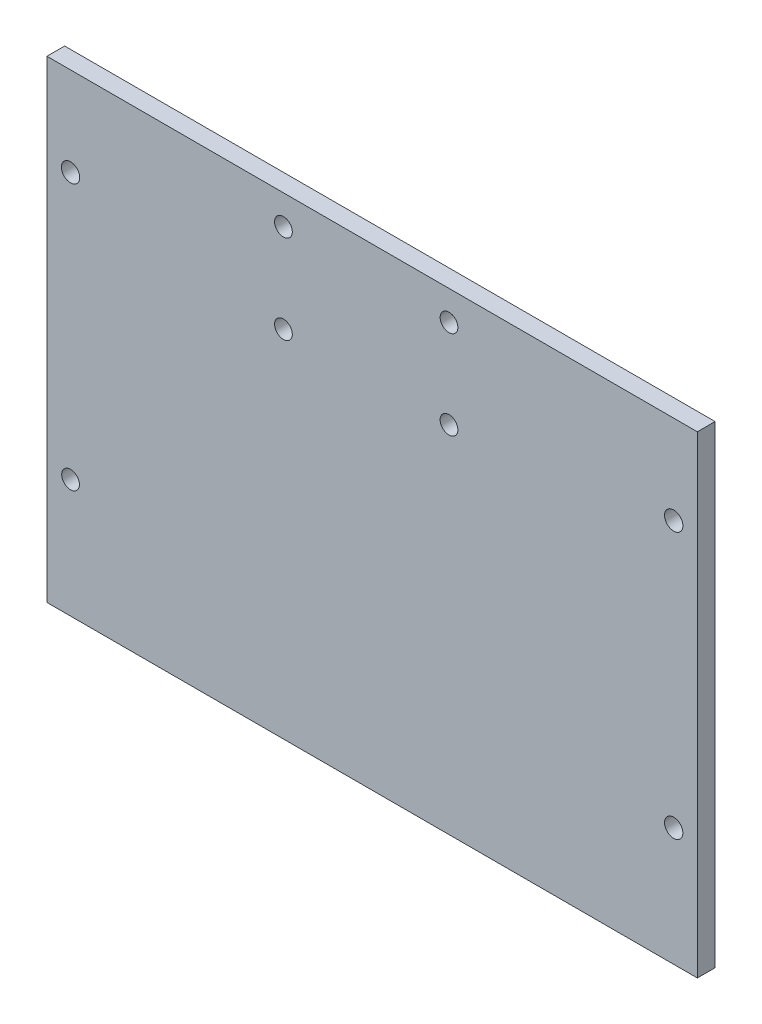
ISO-10303-21;
HEADER;
FILE_DESCRIPTION(('STEP AP214'),'2;1');
FILE_NAME('part.step','',(''),(''),'','','');
FILE_SCHEMA(('AUTOMOTIVE_DESIGN { 1 0 10303 214 1 1 1 1 }'));
ENDSEC;
DATA;
#1=APPLICATION_CONTEXT('core data for automotive mechanical design processes');
#2=APPLICATION_PROTOCOL_DEFINITION('international standard','automotive_design',2000,#1);
#3=PRODUCT_CONTEXT('',#1,'mechanical');
#4=PRODUCT('Part','Part','',(#3));
#5=PRODUCT_RELATED_PRODUCT_CATEGORY('part','',(#4));
#6=PRODUCT_DEFINITION_FORMATION('','',#4);
#7=PRODUCT_DEFINITION_CONTEXT('part definition',#1,'design');
#8=PRODUCT_DEFINITION('design','',#6,#7);
#9=PRODUCT_DEFINITION_SHAPE('','',#8);
#10=(LENGTH_UNIT() NAMED_UNIT(*) SI_UNIT(.MILLI.,.METRE.));
#11=(NAMED_UNIT(*) PLANE_ANGLE_UNIT() SI_UNIT($,.RADIAN.));
#12=(NAMED_UNIT(*) SI_UNIT($,.STERADIAN.) SOLID_ANGLE_UNIT());
#13=UNCERTAINTY_MEASURE_WITH_UNIT(LENGTH_MEASURE(1.E-05),#10,'distance_accuracy_value','');
#14=(GEOMETRIC_REPRESENTATION_CONTEXT(3) GLOBAL_UNCERTAINTY_ASSIGNED_CONTEXT((#13)) GLOBAL_UNIT_ASSIGNED_CONTEXT((#10,
#11,#12)) REPRESENTATION_CONTEXT('',''));
#15=CARTESIAN_POINT('',(0.,0.,0.));
#16=DIRECTION('',(0.,0.,1.));
#17=DIRECTION('',(1.,0.,0.));
#18=AXIS2_PLACEMENT_3D('',#15,#16,#17);
#19=CARTESIAN_POINT('',(-55.,-40.,3.));
#20=DIRECTION('',(1.,0.,0.));
#21=DIRECTION('',(0.,0.,-1.));
#22=AXIS2_PLACEMENT_3D('',#19,#20,#21);
#23=PLANE('',#22);
#24=DIRECTION('',(0.,-1.,0.));
#25=VECTOR('',#24,1.);
#26=CARTESIAN_POINT('',(-55.,-40.,0.));
#27=LINE('',#26,#25);
#28=CARTESIAN_POINT('',(-55.,40.,0.));
#29=VERTEX_POINT('',#28);
#30=CARTESIAN_POINT('',(-55.,-40.,0.));
#31=VERTEX_POINT('',#30);
#32=EDGE_CURVE('E111',#29,#31,#27,.T.);
#33=ORIENTED_EDGE('',*,*,#32,.T.);
#34=DIRECTION('',(0.,0.,-1.));
#35=VECTOR('',#34,1.);
#36=CARTESIAN_POINT('',(-55.,-40.,3.));
#37=LINE('',#36,#35);
#38=CARTESIAN_POINT('',(-55.,-40.,3.));
#39=VERTEX_POINT('',#38);
#40=EDGE_CURVE('E11',#39,#31,#37,.T.);
#41=ORIENTED_EDGE('',*,*,#40,.F.);
#42=DIRECTION('',(0.,-1.,0.));
#43=VECTOR('',#42,1.);
#44=CARTESIAN_POINT('',(-55.,-40.,3.));
#45=LINE('',#44,#43);
#46=CARTESIAN_POINT('',(-55.,40.,3.));
#47=VERTEX_POINT('',#46);
#48=EDGE_CURVE('E95',#47,#39,#45,.T.);
#49=ORIENTED_EDGE('',*,*,#48,.F.);
#50=DIRECTION('',(0.,0.,-1.));
#51=VECTOR('',#50,1.);
#52=CARTESIAN_POINT('',(-55.,40.,3.));
#53=LINE('',#52,#51);
#54=EDGE_CURVE('E107',#47,#29,#53,.T.);
#55=ORIENTED_EDGE('',*,*,#54,.T.);
#56=EDGE_LOOP('',(#33,#41,#49,#55));
#57=FACE_BOUND('',#56,.T.);
#58=ADVANCED_FACE('F43',(#57),#23,.F.);
#59=CARTESIAN_POINT('',(55.,-40.,3.));
#60=DIRECTION('',(0.,1.,0.));
#61=DIRECTION('',(-1.,0.,0.));
#62=AXIS2_PLACEMENT_3D('',#59,#60,#61);
#63=PLANE('',#62);
#64=DIRECTION('',(1.,0.,0.));
#65=VECTOR('',#64,1.);
#66=CARTESIAN_POINT('',(55.,-40.,0.));
#67=LINE('',#66,#65);
#68=CARTESIAN_POINT('',(55.,-40.,0.));
#69=VERTEX_POINT('',#68);
#70=EDGE_CURVE('E100',#31,#69,#67,.T.);
#71=ORIENTED_EDGE('',*,*,#70,.T.);
#72=DIRECTION('',(0.,0.,-1.));
#73=VECTOR('',#72,1.);
#74=CARTESIAN_POINT('',(55.,-40.,3.));
#75=LINE('',#74,#73);
#76=CARTESIAN_POINT('',(55.,-40.,3.));
#77=VERTEX_POINT('',#76);
#78=EDGE_CURVE('E52',#77,#69,#75,.T.);
#79=ORIENTED_EDGE('',*,*,#78,.F.);
#80=DIRECTION('',(1.,0.,0.));
#81=VECTOR('',#80,1.);
#82=CARTESIAN_POINT('',(55.,-40.,3.));
#83=LINE('',#82,#81);
#84=EDGE_CURVE('E90',#39,#77,#83,.T.);
#85=ORIENTED_EDGE('',*,*,#84,.F.);
#86=ORIENTED_EDGE('',*,*,#40,.T.);
#87=EDGE_LOOP('',(#71,#79,#85,#86));
#88=FACE_BOUND('',#87,.T.);
#89=ADVANCED_FACE('F99',(#88),#63,.F.);
#90=CARTESIAN_POINT('',(55.,-40.,3.));
#91=DIRECTION('',(-1.,0.,0.));
#92=DIRECTION('',(0.,0.,1.));
#93=AXIS2_PLACEMENT_3D('',#90,#91,#92);
#94=PLANE('',#93);
#95=DIRECTION('',(0.,1.,0.));
#96=VECTOR('',#95,1.);
#97=CARTESIAN_POINT('',(55.,-40.,0.));
#98=LINE('',#97,#96);
#99=CARTESIAN_POINT('',(55.,40.,0.));
#100=VERTEX_POINT('',#99);
#101=EDGE_CURVE('E77',#69,#100,#98,.T.);
#102=ORIENTED_EDGE('',*,*,#101,.T.);
#103=DIRECTION('',(0.,0.,-1.));
#104=VECTOR('',#103,1.);
#105=CARTESIAN_POINT('',(55.,40.,3.));
#106=LINE('',#105,#104);
#107=CARTESIAN_POINT('',(55.,40.,3.));
#108=VERTEX_POINT('',#107);
#109=EDGE_CURVE('E102',#108,#100,#106,.T.);
#110=ORIENTED_EDGE('',*,*,#109,.F.);
#111=DIRECTION('',(0.,1.,0.));
#112=VECTOR('',#111,1.);
#113=CARTESIAN_POINT('',(55.,-40.,3.));
#114=LINE('',#113,#112);
#115=EDGE_CURVE('E93',#77,#108,#114,.T.);
#116=ORIENTED_EDGE('',*,*,#115,.F.);
#117=ORIENTED_EDGE('',*,*,#78,.T.);
#118=EDGE_LOOP('',(#102,#110,#116,#117));
#119=FACE_BOUND('',#118,.T.);
#120=ADVANCED_FACE('F103',(#119),#94,.F.);
#121=CARTESIAN_POINT('',(55.,40.,3.));
#122=DIRECTION('',(0.,-1.,0.));
#123=DIRECTION('',(1.,0.,0.));
#124=AXIS2_PLACEMENT_3D('',#121,#122,#123);
#125=PLANE('',#124);
#126=DIRECTION('',(-1.,0.,0.));
#127=VECTOR('',#126,1.);
#128=CARTESIAN_POINT('',(55.,40.,0.));
#129=LINE('',#128,#127);
#130=EDGE_CURVE('E83',#100,#29,#129,.T.);
#131=ORIENTED_EDGE('',*,*,#130,.T.);
#132=ORIENTED_EDGE('',*,*,#54,.F.);
#133=DIRECTION('',(-1.,0.,0.));
#134=VECTOR('',#133,1.);
#135=CARTESIAN_POINT('',(55.,40.,3.));
#136=LINE('',#135,#134);
#137=EDGE_CURVE('E60',#108,#47,#136,.T.);
#138=ORIENTED_EDGE('',*,*,#137,.F.);
#139=ORIENTED_EDGE('',*,*,#109,.T.);
#140=EDGE_LOOP('',(#131,#132,#138,#139));
#141=FACE_BOUND('',#140,.T.);
#142=ADVANCED_FACE('F125',(#141),#125,.F.);
#143=CARTESIAN_POINT('',(0.,0.,3.));
#144=DIRECTION('',(0.,0.,1.));
#145=DIRECTION('',(1.,0.,0.));
#146=AXIS2_PLACEMENT_3D('',#143,#144,#145);
#147=PLANE('',#146);
#148=CARTESIAN_POINT('',(51.,25.,3.));
#149=DIRECTION('',(0.,0.,1.));
#150=DIRECTION('',(1.,0.,0.));
#151=AXIS2_PLACEMENT_3D('',#148,#149,#150);
#152=CIRCLE('',#151,1.54999999999999);
#153=CARTESIAN_POINT('',(52.55,25.,3.));
#154=VERTEX_POINT('',#153);
#155=EDGE_CURVE('E163',#154,#154,#152,.T.);
#156=ORIENTED_EDGE('',*,*,#155,.F.);
#157=EDGE_LOOP('',(#156));
#158=FACE_BOUND('',#157,.T.);
#159=CARTESIAN_POINT('',(-51.,-20.,3.));
#160=DIRECTION('',(0.,0.,1.));
#161=DIRECTION('',(1.,0.,0.));
#162=AXIS2_PLACEMENT_3D('',#159,#160,#161);
#163=CIRCLE('',#162,1.5);
#164=CARTESIAN_POINT('',(-49.5,-20.,3.));
#165=VERTEX_POINT('',#164);
#166=EDGE_CURVE('E167',#165,#165,#163,.T.);
#167=ORIENTED_EDGE('',*,*,#166,.F.);
#168=EDGE_LOOP('',(#167));
#169=FACE_BOUND('',#168,.T.);
#170=CARTESIAN_POINT('',(-51.,25.,3.));
#171=DIRECTION('',(0.,0.,1.));
#172=DIRECTION('',(1.,0.,0.));
#173=AXIS2_PLACEMENT_3D('',#170,#171,#172);
#174=CIRCLE('',#173,1.55);
#175=CARTESIAN_POINT('',(-49.45,25.,3.));
#176=VERTEX_POINT('',#175);
#177=EDGE_CURVE('E171',#176,#176,#174,.T.);
#178=ORIENTED_EDGE('',*,*,#177,.F.);
#179=EDGE_LOOP('',(#178));
#180=FACE_BOUND('',#179,.T.);
#181=CARTESIAN_POINT('',(51.,-20.,3.));
#182=DIRECTION('',(0.,0.,1.));
#183=DIRECTION('',(1.,0.,0.));
#184=AXIS2_PLACEMENT_3D('',#181,#182,#183);
#185=CIRCLE('',#184,1.54999999999999);
#186=CARTESIAN_POINT('',(52.55,-20.,3.));
#187=VERTEX_POINT('',#186);
#188=EDGE_CURVE('E175',#187,#187,#185,.T.);
#189=ORIENTED_EDGE('',*,*,#188,.F.);
#190=EDGE_LOOP('',(#189));
#191=FACE_BOUND('',#190,.T.);
#192=CARTESIAN_POINT('',(13.,35.0200000000001,3.));
#193=DIRECTION('',(0.,0.,1.));
#194=DIRECTION('',(1.,0.,0.));
#195=AXIS2_PLACEMENT_3D('',#192,#193,#194);
#196=CIRCLE('',#195,1.49999999999976);
#197=CARTESIAN_POINT('',(14.4999999999998,35.0200000000001,3.));
#198=VERTEX_POINT('',#197);
#199=EDGE_CURVE('E115',#198,#198,#196,.T.);
#200=ORIENTED_EDGE('',*,*,#199,.F.);
#201=EDGE_LOOP('',(#200));
#202=FACE_BOUND('',#201,.T.);
#203=CARTESIAN_POINT('',(-15.,20.0200000000001,3.));
#204=DIRECTION('',(0.,0.,1.));
#205=DIRECTION('',(1.,0.,0.));
#206=AXIS2_PLACEMENT_3D('',#203,#204,#205);
#207=CIRCLE('',#206,1.49999999999976);
#208=CARTESIAN_POINT('',(-13.5000000000002,20.0200000000001,3.));
#209=VERTEX_POINT('',#208);
#210=EDGE_CURVE('E135',#209,#209,#207,.T.);
#211=ORIENTED_EDGE('',*,*,#210,.F.);
#212=EDGE_LOOP('',(#211));
#213=FACE_BOUND('',#212,.T.);
#214=CARTESIAN_POINT('',(-15.,35.02,3.));
#215=DIRECTION('',(0.,0.,1.));
#216=DIRECTION('',(1.,0.,0.));
#217=AXIS2_PLACEMENT_3D('',#214,#215,#216);
#218=CIRCLE('',#217,1.49999999999975);
#219=CARTESIAN_POINT('',(-13.5000000000002,35.02,3.));
#220=VERTEX_POINT('',#219);
#221=EDGE_CURVE('E139',#220,#220,#218,.T.);
#222=ORIENTED_EDGE('',*,*,#221,.F.);
#223=EDGE_LOOP('',(#222));
#224=FACE_BOUND('',#223,.T.);
#225=CARTESIAN_POINT('',(13.,20.02,3.));
#226=DIRECTION('',(0.,0.,1.));
#227=DIRECTION('',(1.,0.,0.));
#228=AXIS2_PLACEMENT_3D('',#225,#226,#227);
#229=CIRCLE('',#228,1.49999999999976);
#230=CARTESIAN_POINT('',(14.4999999999998,20.02,3.));
#231=VERTEX_POINT('',#230);
#232=EDGE_CURVE('E143',#231,#231,#229,.T.);
#233=ORIENTED_EDGE('',*,*,#232,.F.);
#234=EDGE_LOOP('',(#233));
#235=FACE_BOUND('',#234,.T.);
#236=ORIENTED_EDGE('',*,*,#48,.T.);
#237=ORIENTED_EDGE('',*,*,#84,.T.);
#238=ORIENTED_EDGE('',*,*,#115,.T.);
#239=ORIENTED_EDGE('',*,*,#137,.T.);
#240=EDGE_LOOP('',(#236,#237,#238,#239));
#241=FACE_BOUND('',#240,.T.);
#242=ADVANCED_FACE('F91',(#158,#169,#180,#191,#202,#213,#224,#235,#241),#147,.T.);
#243=CARTESIAN_POINT('',(0.,0.,0.));
#244=DIRECTION('',(0.,0.,1.));
#245=DIRECTION('',(1.,0.,0.));
#246=AXIS2_PLACEMENT_3D('',#243,#244,#245);
#247=PLANE('',#246);
#248=CARTESIAN_POINT('',(51.,25.,0.));
#249=DIRECTION('',(0.,0.,-1.));
#250=DIRECTION('',(-1.,0.,0.));
#251=AXIS2_PLACEMENT_3D('',#248,#249,#250);
#252=CIRCLE('',#251,1.54999999999999);
#253=CARTESIAN_POINT('',(49.45,25.,0.));
#254=VERTEX_POINT('',#253);
#255=EDGE_CURVE('E183',#254,#254,#252,.T.);
#256=ORIENTED_EDGE('',*,*,#255,.F.);
#257=EDGE_LOOP('',(#256));
#258=FACE_BOUND('',#257,.T.);
#259=CARTESIAN_POINT('',(-51.,-20.,0.));
#260=DIRECTION('',(0.,0.,-1.));
#261=DIRECTION('',(-1.,0.,0.));
#262=AXIS2_PLACEMENT_3D('',#259,#260,#261);
#263=CIRCLE('',#262,1.5);
#264=CARTESIAN_POINT('',(-52.5,-20.,0.));
#265=VERTEX_POINT('',#264);
#266=EDGE_CURVE('E184',#265,#265,#263,.T.);
#267=ORIENTED_EDGE('',*,*,#266,.F.);
#268=EDGE_LOOP('',(#267));
#269=FACE_BOUND('',#268,.T.);
#270=CARTESIAN_POINT('',(-51.,25.,0.));
#271=DIRECTION('',(0.,0.,-1.));
#272=DIRECTION('',(-1.,0.,0.));
#273=AXIS2_PLACEMENT_3D('',#270,#271,#272);
#274=CIRCLE('',#273,1.55);
#275=CARTESIAN_POINT('',(-52.55,25.,0.));
#276=VERTEX_POINT('',#275);
#277=EDGE_CURVE('E188',#276,#276,#274,.T.);
#278=ORIENTED_EDGE('',*,*,#277,.F.);
#279=EDGE_LOOP('',(#278));
#280=FACE_BOUND('',#279,.T.);
#281=CARTESIAN_POINT('',(51.,-20.,0.));
#282=DIRECTION('',(0.,0.,-1.));
#283=DIRECTION('',(-1.,0.,0.));
#284=AXIS2_PLACEMENT_3D('',#281,#282,#283);
#285=CIRCLE('',#284,1.54999999999999);
#286=CARTESIAN_POINT('',(49.45,-20.,0.));
#287=VERTEX_POINT('',#286);
#288=EDGE_CURVE('E179',#287,#287,#285,.T.);
#289=ORIENTED_EDGE('',*,*,#288,.F.);
#290=EDGE_LOOP('',(#289));
#291=FACE_BOUND('',#290,.T.);
#292=CARTESIAN_POINT('',(13.,35.0200000000001,0.));
#293=DIRECTION('',(0.,0.,-1.));
#294=DIRECTION('',(-1.,0.,0.));
#295=AXIS2_PLACEMENT_3D('',#292,#293,#294);
#296=CIRCLE('',#295,1.49999999999976);
#297=CARTESIAN_POINT('',(11.5000000000002,35.0200000000001,0.));
#298=VERTEX_POINT('',#297);
#299=EDGE_CURVE('E151',#298,#298,#296,.T.);
#300=ORIENTED_EDGE('',*,*,#299,.F.);
#301=EDGE_LOOP('',(#300));
#302=FACE_BOUND('',#301,.T.);
#303=CARTESIAN_POINT('',(-15.,20.0200000000001,0.));
#304=DIRECTION('',(0.,0.,-1.));
#305=DIRECTION('',(-1.,0.,0.));
#306=AXIS2_PLACEMENT_3D('',#303,#304,#305);
#307=CIRCLE('',#306,1.49999999999976);
#308=CARTESIAN_POINT('',(-16.4999999999998,20.0200000000001,0.));
#309=VERTEX_POINT('',#308);
#310=EDGE_CURVE('E152',#309,#309,#307,.T.);
#311=ORIENTED_EDGE('',*,*,#310,.F.);
#312=EDGE_LOOP('',(#311));
#313=FACE_BOUND('',#312,.T.);
#314=CARTESIAN_POINT('',(-15.,35.02,0.));
#315=DIRECTION('',(0.,0.,-1.));
#316=DIRECTION('',(-1.,0.,0.));
#317=AXIS2_PLACEMENT_3D('',#314,#315,#316);
#318=CIRCLE('',#317,1.49999999999975);
#319=CARTESIAN_POINT('',(-16.4999999999998,35.02,0.));
#320=VERTEX_POINT('',#319);
#321=EDGE_CURVE('E156',#320,#320,#318,.T.);
#322=ORIENTED_EDGE('',*,*,#321,.F.);
#323=EDGE_LOOP('',(#322));
#324=FACE_BOUND('',#323,.T.);
#325=CARTESIAN_POINT('',(13.,20.02,0.));
#326=DIRECTION('',(0.,0.,-1.));
#327=DIRECTION('',(-1.,0.,0.));
#328=AXIS2_PLACEMENT_3D('',#325,#326,#327);
#329=CIRCLE('',#328,1.49999999999976);
#330=CARTESIAN_POINT('',(11.5000000000002,20.02,0.));
#331=VERTEX_POINT('',#330);
#332=EDGE_CURVE('E147',#331,#331,#329,.T.);
#333=ORIENTED_EDGE('',*,*,#332,.F.);
#334=EDGE_LOOP('',(#333));
#335=FACE_BOUND('',#334,.T.);
#336=ORIENTED_EDGE('',*,*,#32,.F.);
#337=ORIENTED_EDGE('',*,*,#130,.F.);
#338=ORIENTED_EDGE('',*,*,#101,.F.);
#339=ORIENTED_EDGE('',*,*,#70,.F.);
#340=EDGE_LOOP('',(#336,#337,#338,#339));
#341=FACE_BOUND('',#340,.T.);
#342=ADVANCED_FACE('F128',(#258,#269,#280,#291,#302,#313,#324,#335,#341),#247,.F.);
#343=CARTESIAN_POINT('',(13.,20.02,10.));
#344=DIRECTION('',(0.,0.,-1.));
#345=DIRECTION('',(-1.,0.,0.));
#346=AXIS2_PLACEMENT_3D('',#343,#344,#345);
#347=CYLINDRICAL_SURFACE('',#346,1.49999999999976);
#348=ORIENTED_EDGE('',*,*,#232,.T.);
#349=EDGE_LOOP('',(#348));
#350=FACE_BOUND('',#349,.T.);
#351=ORIENTED_EDGE('',*,*,#332,.T.);
#352=EDGE_LOOP('',(#351));
#353=FACE_BOUND('',#352,.T.);
#354=ADVANCED_FACE('F200',(#350,#353),#347,.F.);
#355=CARTESIAN_POINT('',(-15.,35.02,10.));
#356=DIRECTION('',(0.,0.,-1.));
#357=DIRECTION('',(-1.,0.,0.));
#358=AXIS2_PLACEMENT_3D('',#355,#356,#357);
#359=CYLINDRICAL_SURFACE('',#358,1.49999999999975);
#360=ORIENTED_EDGE('',*,*,#221,.T.);
#361=EDGE_LOOP('',(#360));
#362=FACE_BOUND('',#361,.T.);
#363=ORIENTED_EDGE('',*,*,#321,.T.);
#364=EDGE_LOOP('',(#363));
#365=FACE_BOUND('',#364,.T.);
#366=ADVANCED_FACE('F214',(#362,#365),#359,.F.);
#367=CARTESIAN_POINT('',(-15.,20.0200000000001,10.));
#368=DIRECTION('',(0.,0.,-1.));
#369=DIRECTION('',(-1.,0.,0.));
#370=AXIS2_PLACEMENT_3D('',#367,#368,#369);
#371=CYLINDRICAL_SURFACE('',#370,1.49999999999976);
#372=ORIENTED_EDGE('',*,*,#210,.T.);
#373=EDGE_LOOP('',(#372));
#374=FACE_BOUND('',#373,.T.);
#375=ORIENTED_EDGE('',*,*,#310,.T.);
#376=EDGE_LOOP('',(#375));
#377=FACE_BOUND('',#376,.T.);
#378=ADVANCED_FACE('F220',(#374,#377),#371,.F.);
#379=CARTESIAN_POINT('',(13.,35.0200000000001,10.));
#380=DIRECTION('',(0.,0.,-1.));
#381=DIRECTION('',(-1.,0.,0.));
#382=AXIS2_PLACEMENT_3D('',#379,#380,#381);
#383=CYLINDRICAL_SURFACE('',#382,1.49999999999976);
#384=ORIENTED_EDGE('',*,*,#199,.T.);
#385=EDGE_LOOP('',(#384));
#386=FACE_BOUND('',#385,.T.);
#387=ORIENTED_EDGE('',*,*,#299,.T.);
#388=EDGE_LOOP('',(#387));
#389=FACE_BOUND('',#388,.T.);
#390=ADVANCED_FACE('F258',(#386,#389),#383,.F.);
#391=CARTESIAN_POINT('',(51.,-20.,10.));
#392=DIRECTION('',(0.,0.,-1.));
#393=DIRECTION('',(-1.,0.,0.));
#394=AXIS2_PLACEMENT_3D('',#391,#392,#393);
#395=CYLINDRICAL_SURFACE('',#394,1.54999999999999);
#396=ORIENTED_EDGE('',*,*,#188,.T.);
#397=EDGE_LOOP('',(#396));
#398=FACE_BOUND('',#397,.T.);
#399=ORIENTED_EDGE('',*,*,#288,.T.);
#400=EDGE_LOOP('',(#399));
#401=FACE_BOUND('',#400,.T.);
#402=ADVANCED_FACE('F262',(#398,#401),#395,.F.);
#403=CARTESIAN_POINT('',(-51.,25.,10.));
#404=DIRECTION('',(0.,0.,-1.));
#405=DIRECTION('',(-1.,0.,0.));
#406=AXIS2_PLACEMENT_3D('',#403,#404,#405);
#407=CYLINDRICAL_SURFACE('',#406,1.55);
#408=ORIENTED_EDGE('',*,*,#177,.T.);
#409=EDGE_LOOP('',(#408));
#410=FACE_BOUND('',#409,.T.);
#411=ORIENTED_EDGE('',*,*,#277,.T.);
#412=EDGE_LOOP('',(#411));
#413=FACE_BOUND('',#412,.T.);
#414=ADVANCED_FACE('F196',(#410,#413),#407,.F.);
#415=CARTESIAN_POINT('',(-51.,-20.,10.));
#416=DIRECTION('',(0.,0.,-1.));
#417=DIRECTION('',(-1.,0.,0.));
#418=AXIS2_PLACEMENT_3D('',#415,#416,#417);
#419=CYLINDRICAL_SURFACE('',#418,1.5);
#420=ORIENTED_EDGE('',*,*,#166,.T.);
#421=EDGE_LOOP('',(#420));
#422=FACE_BOUND('',#421,.T.);
#423=ORIENTED_EDGE('',*,*,#266,.T.);
#424=EDGE_LOOP('',(#423));
#425=FACE_BOUND('',#424,.T.);
#426=ADVANCED_FACE('F269',(#422,#425),#419,.F.);
#427=CARTESIAN_POINT('',(51.,25.,10.));
#428=DIRECTION('',(0.,0.,-1.));
#429=DIRECTION('',(-1.,0.,0.));
#430=AXIS2_PLACEMENT_3D('',#427,#428,#429);
#431=CYLINDRICAL_SURFACE('',#430,1.54999999999999);
#432=ORIENTED_EDGE('',*,*,#155,.T.);
#433=EDGE_LOOP('',(#432));
#434=FACE_BOUND('',#433,.T.);
#435=ORIENTED_EDGE('',*,*,#255,.T.);
#436=EDGE_LOOP('',(#435));
#437=FACE_BOUND('',#436,.T.);
#438=ADVANCED_FACE('F272',(#434,#437),#431,.F.);
#439=CLOSED_SHELL('',(#58,#89,#120,#142,#242,#342,#354,#366,#378,#390,#402,#414,#426,#438));
#440=MANIFOLD_SOLID_BREP('B2',#439);
#441=ADVANCED_BREP_SHAPE_REPRESENTATION('',(#18,#440),#14);
#442=SHAPE_DEFINITION_REPRESENTATION(#9,#441);
ENDSEC;
END-ISO-10303-21;
